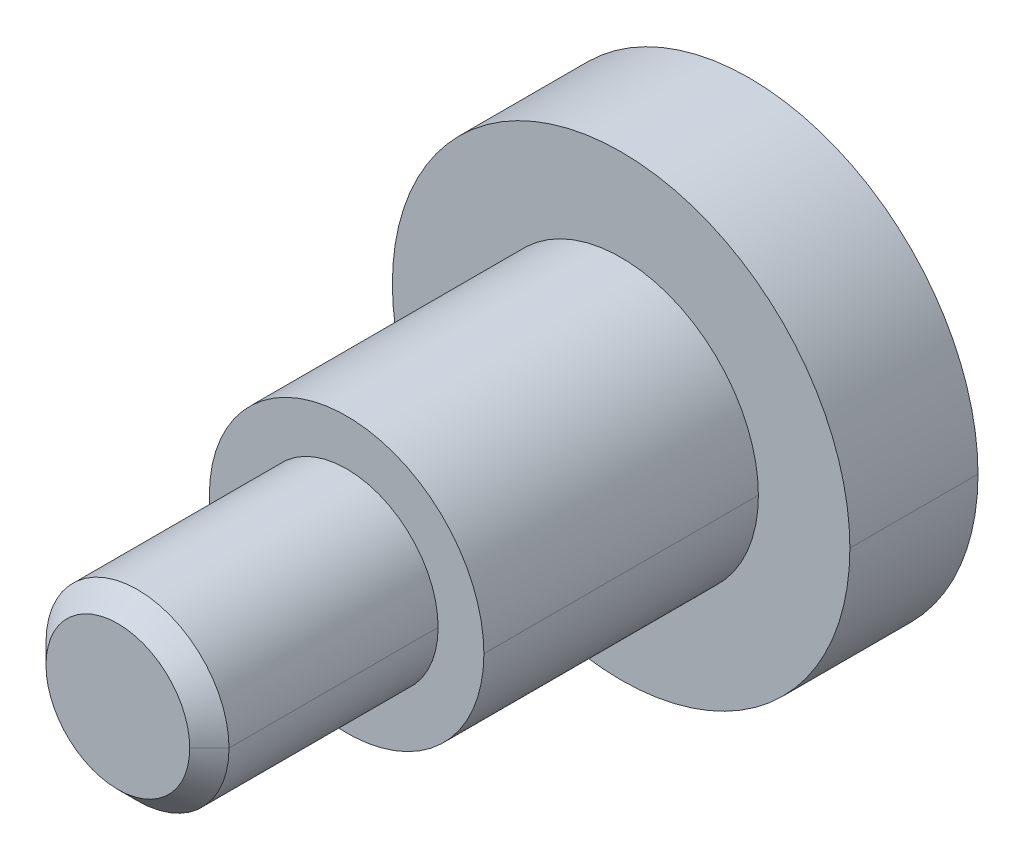
ISO-10303-21;
HEADER;
FILE_DESCRIPTION(('STEP AP214'),'2;1');
FILE_NAME('part.step','',(''),(''),'','','');
FILE_SCHEMA(('AUTOMOTIVE_DESIGN { 1 0 10303 214 1 1 1 1 }'));
ENDSEC;
DATA;
#1=APPLICATION_CONTEXT('core data for automotive mechanical design processes');
#2=APPLICATION_PROTOCOL_DEFINITION('international standard','automotive_design',2000,#1);
#3=PRODUCT_CONTEXT('',#1,'mechanical');
#4=PRODUCT('Part','Part','',(#3));
#5=PRODUCT_RELATED_PRODUCT_CATEGORY('part','',(#4));
#6=PRODUCT_DEFINITION_FORMATION('','',#4);
#7=PRODUCT_DEFINITION_CONTEXT('part definition',#1,'design');
#8=PRODUCT_DEFINITION('design','',#6,#7);
#9=PRODUCT_DEFINITION_SHAPE('','',#8);
#10=(LENGTH_UNIT() NAMED_UNIT(*) SI_UNIT(.MILLI.,.METRE.));
#11=(NAMED_UNIT(*) PLANE_ANGLE_UNIT() SI_UNIT($,.RADIAN.));
#12=(NAMED_UNIT(*) SI_UNIT($,.STERADIAN.) SOLID_ANGLE_UNIT());
#13=UNCERTAINTY_MEASURE_WITH_UNIT(LENGTH_MEASURE(1.E-05),#10,'distance_accuracy_value','');
#14=(GEOMETRIC_REPRESENTATION_CONTEXT(3) GLOBAL_UNCERTAINTY_ASSIGNED_CONTEXT((#13)) GLOBAL_UNIT_ASSIGNED_CONTEXT((#10,
#11,#12)) REPRESENTATION_CONTEXT('',''));
#15=CARTESIAN_POINT('',(0.,0.,0.));
#16=DIRECTION('',(0.,0.,1.));
#17=DIRECTION('',(1.,0.,0.));
#18=AXIS2_PLACEMENT_3D('',#15,#16,#17);
#19=CARTESIAN_POINT('',(0.,0.,2.5));
#20=DIRECTION('',(0.,0.,-1.));
#21=DIRECTION('',(0.,-1.,0.));
#22=AXIS2_PLACEMENT_3D('',#19,#20,#21);
#23=PLANE('',#22);
#24=DIRECTION('',(0.5,0.866025403784439,0.));
#25=VECTOR('',#24,1.);
#26=CARTESIAN_POINT('',(-1.44337567297406,0.,2.5));
#27=LINE('',#26,#25);
#28=CARTESIAN_POINT('',(-1.44337567297406,0.,2.5));
#29=VERTEX_POINT('',#28);
#30=CARTESIAN_POINT('',(-0.721687836487032,1.25,2.5));
#31=VERTEX_POINT('',#30);
#32=EDGE_CURVE('E266',#29,#31,#27,.T.);
#33=ORIENTED_EDGE('',*,*,#32,.T.);
#34=DIRECTION('',(1.,0.,0.));
#35=VECTOR('',#34,1.);
#36=CARTESIAN_POINT('',(-0.721687836487032,1.25,2.5));
#37=LINE('',#36,#35);
#38=CARTESIAN_POINT('',(0.721687836487032,1.25,2.5));
#39=VERTEX_POINT('',#38);
#40=EDGE_CURVE('E9',#31,#39,#37,.T.);
#41=ORIENTED_EDGE('',*,*,#40,.T.);
#42=DIRECTION('',(0.5,-0.866025403784439,0.));
#43=VECTOR('',#42,1.);
#44=CARTESIAN_POINT('',(0.721687836487032,1.25,2.5));
#45=LINE('',#44,#43);
#46=CARTESIAN_POINT('',(1.44337567297406,0.,2.5));
#47=VERTEX_POINT('',#46);
#48=EDGE_CURVE('E42',#39,#47,#45,.T.);
#49=ORIENTED_EDGE('',*,*,#48,.T.);
#50=DIRECTION('',(-0.5,-0.866025403784439,0.));
#51=VECTOR('',#50,1.);
#52=CARTESIAN_POINT('',(1.44337567297406,0.,2.5));
#53=LINE('',#52,#51);
#54=CARTESIAN_POINT('',(0.721687836487032,-1.25,2.5));
#55=VERTEX_POINT('',#54);
#56=EDGE_CURVE('E279',#47,#55,#53,.T.);
#57=ORIENTED_EDGE('',*,*,#56,.T.);
#58=DIRECTION('',(-1.,0.,0.));
#59=VECTOR('',#58,1.);
#60=CARTESIAN_POINT('',(0.721687836487032,-1.25,2.5));
#61=LINE('',#60,#59);
#62=CARTESIAN_POINT('',(-0.721687836487033,-1.25,2.5));
#63=VERTEX_POINT('',#62);
#64=EDGE_CURVE('E273',#55,#63,#61,.T.);
#65=ORIENTED_EDGE('',*,*,#64,.T.);
#66=DIRECTION('',(-0.5,0.866025403784439,0.));
#67=VECTOR('',#66,1.);
#68=CARTESIAN_POINT('',(-0.721687836487033,-1.25,2.5));
#69=LINE('',#68,#67);
#70=EDGE_CURVE('E172',#63,#29,#69,.T.);
#71=ORIENTED_EDGE('',*,*,#70,.T.);
#72=EDGE_LOOP('',(#33,#41,#49,#57,#65,#71));
#73=FACE_BOUND('',#72,.T.);
#74=ADVANCED_FACE('F15',(#73),#23,.T.);
#75=CARTESIAN_POINT('',(-0.721687836487032,1.25,2.5));
#76=DIRECTION('',(0.,1.,0.));
#77=DIRECTION('',(1.,0.,0.));
#78=AXIS2_PLACEMENT_3D('',#75,#76,#77);
#79=PLANE('',#78);
#80=DIRECTION('',(1.,0.,0.));
#81=VECTOR('',#80,1.);
#82=CARTESIAN_POINT('',(-0.721687836487032,1.25,0.));
#83=LINE('',#82,#81);
#84=CARTESIAN_POINT('',(-0.721687836487032,1.25,0.));
#85=VERTEX_POINT('',#84);
#86=CARTESIAN_POINT('',(0.721687836487032,1.25,0.));
#87=VERTEX_POINT('',#86);
#88=EDGE_CURVE('E230',#85,#87,#83,.T.);
#89=ORIENTED_EDGE('',*,*,#88,.T.);
#90=DIRECTION('',(0.,0.,-1.));
#91=VECTOR('',#90,1.);
#92=CARTESIAN_POINT('',(0.721687836487032,1.25,2.5));
#93=LINE('',#92,#91);
#94=EDGE_CURVE('E23',#39,#87,#93,.T.);
#95=ORIENTED_EDGE('',*,*,#94,.F.);
#96=ORIENTED_EDGE('',*,*,#40,.F.);
#97=DIRECTION('',(0.,0.,-1.));
#98=VECTOR('',#97,1.);
#99=CARTESIAN_POINT('',(-0.721687836487032,1.25,2.5));
#100=LINE('',#99,#98);
#101=EDGE_CURVE('E150',#31,#85,#100,.T.);
#102=ORIENTED_EDGE('',*,*,#101,.T.);
#103=EDGE_LOOP('',(#89,#95,#96,#102));
#104=FACE_BOUND('',#103,.T.);
#105=ADVANCED_FACE('F664',(#104),#79,.F.);
#106=CARTESIAN_POINT('',(0.721687836487032,1.25,2.5));
#107=DIRECTION('',(0.866025403784439,0.5,0.));
#108=DIRECTION('',(0.,0.,-1.));
#109=AXIS2_PLACEMENT_3D('',#106,#107,#108);
#110=PLANE('',#109);
#111=DIRECTION('',(0.5,-0.866025403784439,0.));
#112=VECTOR('',#111,1.);
#113=CARTESIAN_POINT('',(0.721687836487032,1.25,0.));
#114=LINE('',#113,#112);
#115=CARTESIAN_POINT('',(1.44337567297406,0.,0.));
#116=VERTEX_POINT('',#115);
#117=EDGE_CURVE('E247',#87,#116,#114,.T.);
#118=ORIENTED_EDGE('',*,*,#117,.T.);
#119=DIRECTION('',(0.,0.,-1.));
#120=VECTOR('',#119,1.);
#121=CARTESIAN_POINT('',(1.44337567297406,0.,2.5));
#122=LINE('',#121,#120);
#123=EDGE_CURVE('E282',#47,#116,#122,.T.);
#124=ORIENTED_EDGE('',*,*,#123,.F.);
#125=ORIENTED_EDGE('',*,*,#48,.F.);
#126=ORIENTED_EDGE('',*,*,#94,.T.);
#127=EDGE_LOOP('',(#118,#124,#125,#126));
#128=FACE_BOUND('',#127,.T.);
#129=ADVANCED_FACE('F495',(#128),#110,.F.);
#130=CARTESIAN_POINT('',(1.44337567297406,0.,2.5));
#131=DIRECTION('',(0.866025403784439,-0.5,0.));
#132=DIRECTION('',(0.,0.,-1.));
#133=AXIS2_PLACEMENT_3D('',#130,#131,#132);
#134=PLANE('',#133);
#135=DIRECTION('',(-0.5,-0.866025403784439,0.));
#136=VECTOR('',#135,1.);
#137=CARTESIAN_POINT('',(1.44337567297406,0.,0.));
#138=LINE('',#137,#136);
#139=CARTESIAN_POINT('',(0.721687836487032,-1.25,0.));
#140=VERTEX_POINT('',#139);
#141=EDGE_CURVE('E243',#116,#140,#138,.T.);
#142=ORIENTED_EDGE('',*,*,#141,.T.);
#143=DIRECTION('',(0.,0.,-1.));
#144=VECTOR('',#143,1.);
#145=CARTESIAN_POINT('',(0.721687836487032,-1.25,2.5));
#146=LINE('',#145,#144);
#147=EDGE_CURVE('E276',#55,#140,#146,.T.);
#148=ORIENTED_EDGE('',*,*,#147,.F.);
#149=ORIENTED_EDGE('',*,*,#56,.F.);
#150=ORIENTED_EDGE('',*,*,#123,.T.);
#151=EDGE_LOOP('',(#142,#148,#149,#150));
#152=FACE_BOUND('',#151,.T.);
#153=ADVANCED_FACE('F489',(#152),#134,.F.);
#154=CARTESIAN_POINT('',(0.721687836487032,-1.25,2.5));
#155=DIRECTION('',(0.,-1.,0.));
#156=DIRECTION('',(0.,0.,-1.));
#157=AXIS2_PLACEMENT_3D('',#154,#155,#156);
#158=PLANE('',#157);
#159=DIRECTION('',(-1.,0.,0.));
#160=VECTOR('',#159,1.);
#161=CARTESIAN_POINT('',(0.721687836487032,-1.25,0.));
#162=LINE('',#161,#160);
#163=CARTESIAN_POINT('',(-0.721687836487033,-1.25,0.));
#164=VERTEX_POINT('',#163);
#165=EDGE_CURVE('E242',#140,#164,#162,.T.);
#166=ORIENTED_EDGE('',*,*,#165,.T.);
#167=DIRECTION('',(0.,0.,-1.));
#168=VECTOR('',#167,1.);
#169=CARTESIAN_POINT('',(-0.721687836487033,-1.25,2.5));
#170=LINE('',#169,#168);
#171=EDGE_CURVE('E174',#63,#164,#170,.T.);
#172=ORIENTED_EDGE('',*,*,#171,.F.);
#173=ORIENTED_EDGE('',*,*,#64,.F.);
#174=ORIENTED_EDGE('',*,*,#147,.T.);
#175=EDGE_LOOP('',(#166,#172,#173,#174));
#176=FACE_BOUND('',#175,.T.);
#177=ADVANCED_FACE('F494',(#176),#158,.F.);
#178=CARTESIAN_POINT('',(-0.721687836487033,-1.25,2.5));
#179=DIRECTION('',(-0.866025403784439,-0.5,0.));
#180=DIRECTION('',(-0.5,0.866025403784439,0.));
#181=AXIS2_PLACEMENT_3D('',#178,#179,#180);
#182=PLANE('',#181);
#183=DIRECTION('',(-0.5,0.866025403784439,0.));
#184=VECTOR('',#183,1.);
#185=CARTESIAN_POINT('',(-0.721687836487033,-1.25,0.));
#186=LINE('',#185,#184);
#187=CARTESIAN_POINT('',(-1.44337567297406,0.,0.));
#188=VERTEX_POINT('',#187);
#189=EDGE_CURVE('E238',#164,#188,#186,.T.);
#190=ORIENTED_EDGE('',*,*,#189,.T.);
#191=DIRECTION('',(0.,0.,-1.));
#192=VECTOR('',#191,1.);
#193=CARTESIAN_POINT('',(-1.44337567297406,0.,2.5));
#194=LINE('',#193,#192);
#195=EDGE_CURVE('E175',#29,#188,#194,.T.);
#196=ORIENTED_EDGE('',*,*,#195,.F.);
#197=ORIENTED_EDGE('',*,*,#70,.F.);
#198=ORIENTED_EDGE('',*,*,#171,.T.);
#199=EDGE_LOOP('',(#190,#196,#197,#198));
#200=FACE_BOUND('',#199,.T.);
#201=ADVANCED_FACE('F591',(#200),#182,.F.);
#202=CARTESIAN_POINT('',(-1.44337567297406,0.,2.5));
#203=DIRECTION('',(-0.866025403784439,0.5,0.));
#204=DIRECTION('',(0.,0.,1.));
#205=AXIS2_PLACEMENT_3D('',#202,#203,#204);
#206=PLANE('',#205);
#207=DIRECTION('',(0.5,0.866025403784439,0.));
#208=VECTOR('',#207,1.);
#209=CARTESIAN_POINT('',(-1.44337567297406,0.,0.));
#210=LINE('',#209,#208);
#211=EDGE_CURVE('E234',#188,#85,#210,.T.);
#212=ORIENTED_EDGE('',*,*,#211,.T.);
#213=ORIENTED_EDGE('',*,*,#101,.F.);
#214=ORIENTED_EDGE('',*,*,#32,.F.);
#215=ORIENTED_EDGE('',*,*,#195,.T.);
#216=EDGE_LOOP('',(#212,#213,#214,#215));
#217=FACE_BOUND('',#216,.T.);
#218=ADVANCED_FACE('F595',(#217),#206,.F.);
#219=CARTESIAN_POINT('',(0.,0.,13.8));
#220=DIRECTION('',(0.,0.,-1.));
#221=DIRECTION('',(-1.,0.,0.));
#222=AXIS2_PLACEMENT_3D('',#219,#220,#221);
#223=CONICAL_SURFACE('',#222,1.5705,0.785398163397446);
#224=DIRECTION('',(0.707106781186546,0.,-0.707106781186549));
#225=VECTOR('',#224,1.);
#226=CARTESIAN_POINT('',(1.5705,0.,13.8));
#227=LINE('',#226,#225);
#228=CARTESIAN_POINT('',(1.5705,0.,13.8));
#229=VERTEX_POINT('',#228);
#230=CARTESIAN_POINT('',(2.,0.,13.3705));
#231=VERTEX_POINT('',#230);
#232=EDGE_CURVE('E154',#229,#231,#227,.T.);
#233=ORIENTED_EDGE('',*,*,#232,.F.);
#234=CARTESIAN_POINT('',(0.,0.,13.8));
#235=DIRECTION('',(0.,0.,1.));
#236=DIRECTION('',(1.,0.,0.));
#237=AXIS2_PLACEMENT_3D('',#234,#235,#236);
#238=CIRCLE('',#237,1.5705);
#239=CARTESIAN_POINT('',(-1.5705,0.,13.8));
#240=VERTEX_POINT('',#239);
#241=EDGE_CURVE('E141',#240,#229,#238,.T.);
#242=ORIENTED_EDGE('',*,*,#241,.F.);
#243=DIRECTION('',(-0.707106781186546,0.,-0.707106781186549));
#244=VECTOR('',#243,1.);
#245=CARTESIAN_POINT('',(-1.5705,0.,13.8));
#246=LINE('',#245,#244);
#247=CARTESIAN_POINT('',(-2.,0.,13.3705));
#248=VERTEX_POINT('',#247);
#249=EDGE_CURVE('E163',#240,#248,#246,.T.);
#250=ORIENTED_EDGE('',*,*,#249,.T.);
#251=CARTESIAN_POINT('',(0.,0.,13.3705));
#252=DIRECTION('',(0.,0.,-1.));
#253=DIRECTION('',(1.,0.,0.));
#254=AXIS2_PLACEMENT_3D('',#251,#252,#253);
#255=CIRCLE('',#254,2.);
#256=EDGE_CURVE('E151',#231,#248,#255,.T.);
#257=ORIENTED_EDGE('',*,*,#256,.F.);
#258=EDGE_LOOP('',(#233,#242,#250,#257));
#259=FACE_BOUND('',#258,.T.);
#260=ADVANCED_FACE('F155',(#259),#223,.T.);
#261=CARTESIAN_POINT('',(0.,0.,13.8));
#262=DIRECTION('',(0.,0.,1.));
#263=DIRECTION('',(1.,0.,0.));
#264=AXIS2_PLACEMENT_3D('',#261,#262,#263);
#265=PLANE('',#264);
#266=ORIENTED_EDGE('',*,*,#241,.T.);
#267=CARTESIAN_POINT('',(0.,0.,13.8));
#268=DIRECTION('',(0.,0.,1.));
#269=DIRECTION('',(1.,0.,0.));
#270=AXIS2_PLACEMENT_3D('',#267,#268,#269);
#271=CIRCLE('',#270,1.5705);
#272=EDGE_CURVE('E145',#229,#240,#271,.T.);
#273=ORIENTED_EDGE('',*,*,#272,.T.);
#274=EDGE_LOOP('',(#266,#273));
#275=FACE_BOUND('',#274,.T.);
#276=ADVANCED_FACE('F143',(#275),#265,.T.);
#277=CARTESIAN_POINT('',(0.,0.,13.8));
#278=DIRECTION('',(0.,0.,-1.));
#279=DIRECTION('',(-1.,0.,0.));
#280=AXIS2_PLACEMENT_3D('',#277,#278,#279);
#281=CYLINDRICAL_SURFACE('',#280,2.);
#282=DIRECTION('',(0.,0.,-1.));
#283=VECTOR('',#282,1.);
#284=CARTESIAN_POINT('',(2.,0.,13.8));
#285=LINE('',#284,#283);
#286=CARTESIAN_POINT('',(2.,0.,8.8));
#287=VERTEX_POINT('',#286);
#288=EDGE_CURVE('E183',#231,#287,#285,.T.);
#289=ORIENTED_EDGE('',*,*,#288,.F.);
#290=ORIENTED_EDGE('',*,*,#256,.T.);
#291=DIRECTION('',(0.,0.,-1.));
#292=VECTOR('',#291,1.);
#293=CARTESIAN_POINT('',(-2.,0.,13.8));
#294=LINE('',#293,#292);
#295=CARTESIAN_POINT('',(-2.,0.,8.8));
#296=VERTEX_POINT('',#295);
#297=EDGE_CURVE('E191',#248,#296,#294,.T.);
#298=ORIENTED_EDGE('',*,*,#297,.T.);
#299=CARTESIAN_POINT('',(0.,0.,8.8));
#300=DIRECTION('',(0.,0.,1.));
#301=DIRECTION('',(1.,0.,0.));
#302=AXIS2_PLACEMENT_3D('',#299,#300,#301);
#303=CIRCLE('',#302,2.);
#304=EDGE_CURVE('E259',#296,#287,#303,.T.);
#305=ORIENTED_EDGE('',*,*,#304,.T.);
#306=EDGE_LOOP('',(#289,#290,#298,#305));
#307=FACE_BOUND('',#306,.T.);
#308=ADVANCED_FACE('F503',(#307),#281,.T.);
#309=CARTESIAN_POINT('',(0.,0.,8.8));
#310=DIRECTION('',(0.,0.,1.));
#311=DIRECTION('',(1.,0.,0.));
#312=AXIS2_PLACEMENT_3D('',#309,#310,#311);
#313=PLANE('',#312);
#314=ORIENTED_EDGE('',*,*,#304,.F.);
#315=CARTESIAN_POINT('',(0.,0.,8.8));
#316=DIRECTION('',(0.,0.,1.));
#317=DIRECTION('',(1.,0.,0.));
#318=AXIS2_PLACEMENT_3D('',#315,#316,#317);
#319=CIRCLE('',#318,2.);
#320=EDGE_CURVE('E187',#287,#296,#319,.T.);
#321=ORIENTED_EDGE('',*,*,#320,.F.);
#322=EDGE_LOOP('',(#314,#321));
#323=FACE_BOUND('',#322,.T.);
#324=CARTESIAN_POINT('',(0.,0.,8.8));
#325=DIRECTION('',(0.,0.,1.));
#326=DIRECTION('',(1.,0.,0.));
#327=AXIS2_PLACEMENT_3D('',#324,#325,#326);
#328=CIRCLE('',#327,3.);
#329=CARTESIAN_POINT('',(-3.,0.,8.8));
#330=VERTEX_POINT('',#329);
#331=CARTESIAN_POINT('',(3.,0.,8.8));
#332=VERTEX_POINT('',#331);
#333=EDGE_CURVE('E254',#330,#332,#328,.T.);
#334=ORIENTED_EDGE('',*,*,#333,.T.);
#335=CARTESIAN_POINT('',(0.,0.,8.8));
#336=DIRECTION('',(0.,0.,1.));
#337=DIRECTION('',(1.,0.,0.));
#338=AXIS2_PLACEMENT_3D('',#335,#336,#337);
#339=CIRCLE('',#338,3.);
#340=EDGE_CURVE('E195',#332,#330,#339,.T.);
#341=ORIENTED_EDGE('',*,*,#340,.T.);
#342=EDGE_LOOP('',(#334,#341));
#343=FACE_BOUND('',#342,.T.);
#344=ADVANCED_FACE('F507',(#323,#343),#313,.T.);
#345=CARTESIAN_POINT('',(0.,0.,8.8));
#346=DIRECTION('',(0.,0.,-1.));
#347=DIRECTION('',(-1.,0.,0.));
#348=AXIS2_PLACEMENT_3D('',#345,#346,#347);
#349=CYLINDRICAL_SURFACE('',#348,3.);
#350=DIRECTION('',(0.,0.,-1.));
#351=VECTOR('',#350,1.);
#352=CARTESIAN_POINT('',(3.,0.,8.8));
#353=LINE('',#352,#351);
#354=CARTESIAN_POINT('',(3.,0.,2.8));
#355=VERTEX_POINT('',#354);
#356=EDGE_CURVE('E204',#332,#355,#353,.T.);
#357=ORIENTED_EDGE('',*,*,#356,.F.);
#358=ORIENTED_EDGE('',*,*,#333,.F.);
#359=DIRECTION('',(0.,0.,-1.));
#360=VECTOR('',#359,1.);
#361=CARTESIAN_POINT('',(-3.,0.,8.8));
#362=LINE('',#361,#360);
#363=CARTESIAN_POINT('',(-3.,0.,2.8));
#364=VERTEX_POINT('',#363);
#365=EDGE_CURVE('E182',#330,#364,#362,.T.);
#366=ORIENTED_EDGE('',*,*,#365,.T.);
#367=CARTESIAN_POINT('',(0.,0.,2.8));
#368=DIRECTION('',(0.,0.,1.));
#369=DIRECTION('',(1.,0.,0.));
#370=AXIS2_PLACEMENT_3D('',#367,#368,#369);
#371=CIRCLE('',#370,3.);
#372=EDGE_CURVE('E227',#364,#355,#371,.T.);
#373=ORIENTED_EDGE('',*,*,#372,.T.);
#374=EDGE_LOOP('',(#357,#358,#366,#373));
#375=FACE_BOUND('',#374,.T.);
#376=ADVANCED_FACE('F583',(#375),#349,.T.);
#377=CARTESIAN_POINT('',(0.,0.,0.));
#378=DIRECTION('',(0.,0.,1.));
#379=DIRECTION('',(1.,0.,0.));
#380=AXIS2_PLACEMENT_3D('',#377,#378,#379);
#381=PLANE('',#380);
#382=ORIENTED_EDGE('',*,*,#88,.F.);
#383=ORIENTED_EDGE('',*,*,#211,.F.);
#384=ORIENTED_EDGE('',*,*,#189,.F.);
#385=ORIENTED_EDGE('',*,*,#165,.F.);
#386=ORIENTED_EDGE('',*,*,#141,.F.);
#387=ORIENTED_EDGE('',*,*,#117,.F.);
#388=EDGE_LOOP('',(#382,#383,#384,#385,#386,#387));
#389=FACE_BOUND('',#388,.T.);
#390=CARTESIAN_POINT('',(0.,0.,0.));
#391=DIRECTION('',(0.,0.,1.));
#392=DIRECTION('',(1.,0.,0.));
#393=AXIS2_PLACEMENT_3D('',#390,#391,#392);
#394=CIRCLE('',#393,5.);
#395=CARTESIAN_POINT('',(-5.,0.,0.));
#396=VERTEX_POINT('',#395);
#397=CARTESIAN_POINT('',(5.,0.,0.));
#398=VERTEX_POINT('',#397);
#399=EDGE_CURVE('E199',#396,#398,#394,.T.);
#400=ORIENTED_EDGE('',*,*,#399,.F.);
#401=CARTESIAN_POINT('',(0.,0.,0.));
#402=DIRECTION('',(0.,0.,1.));
#403=DIRECTION('',(1.,0.,0.));
#404=AXIS2_PLACEMENT_3D('',#401,#402,#403);
#405=CIRCLE('',#404,5.);
#406=EDGE_CURVE('E205',#398,#396,#405,.T.);
#407=ORIENTED_EDGE('',*,*,#406,.F.);
#408=EDGE_LOOP('',(#400,#407));
#409=FACE_BOUND('',#408,.T.);
#410=ADVANCED_FACE('F530',(#389,#409),#381,.F.);
#411=CARTESIAN_POINT('',(0.,0.,2.8));
#412=DIRECTION('',(0.,0.,1.));
#413=DIRECTION('',(1.,0.,0.));
#414=AXIS2_PLACEMENT_3D('',#411,#412,#413);
#415=PLANE('',#414);
#416=ORIENTED_EDGE('',*,*,#372,.F.);
#417=CARTESIAN_POINT('',(0.,0.,2.8));
#418=DIRECTION('',(0.,0.,1.));
#419=DIRECTION('',(1.,0.,0.));
#420=AXIS2_PLACEMENT_3D('',#417,#418,#419);
#421=CIRCLE('',#420,3.);
#422=EDGE_CURVE('E212',#355,#364,#421,.T.);
#423=ORIENTED_EDGE('',*,*,#422,.F.);
#424=EDGE_LOOP('',(#416,#423));
#425=FACE_BOUND('',#424,.T.);
#426=CARTESIAN_POINT('',(0.,0.,2.8));
#427=DIRECTION('',(0.,0.,1.));
#428=DIRECTION('',(1.,0.,0.));
#429=AXIS2_PLACEMENT_3D('',#426,#427,#428);
#430=CIRCLE('',#429,5.);
#431=CARTESIAN_POINT('',(-5.,0.,2.8));
#432=VERTEX_POINT('',#431);
#433=CARTESIAN_POINT('',(5.,0.,2.8));
#434=VERTEX_POINT('',#433);
#435=EDGE_CURVE('E196',#432,#434,#430,.T.);
#436=ORIENTED_EDGE('',*,*,#435,.T.);
#437=CARTESIAN_POINT('',(0.,0.,2.8));
#438=DIRECTION('',(0.,0.,1.));
#439=DIRECTION('',(1.,0.,0.));
#440=AXIS2_PLACEMENT_3D('',#437,#438,#439);
#441=CIRCLE('',#440,5.);
#442=EDGE_CURVE('E177',#434,#432,#441,.T.);
#443=ORIENTED_EDGE('',*,*,#442,.T.);
#444=EDGE_LOOP('',(#436,#443));
#445=FACE_BOUND('',#444,.T.);
#446=ADVANCED_FACE('F525',(#425,#445),#415,.T.);
#447=CARTESIAN_POINT('',(0.,0.,2.8));
#448=DIRECTION('',(0.,0.,-1.));
#449=DIRECTION('',(-1.,0.,0.));
#450=AXIS2_PLACEMENT_3D('',#447,#448,#449);
#451=CYLINDRICAL_SURFACE('',#450,5.);
#452=DIRECTION('',(0.,0.,-1.));
#453=VECTOR('',#452,1.);
#454=CARTESIAN_POINT('',(5.,0.,2.8));
#455=LINE('',#454,#453);
#456=EDGE_CURVE('E181',#434,#398,#455,.T.);
#457=ORIENTED_EDGE('',*,*,#456,.F.);
#458=ORIENTED_EDGE('',*,*,#435,.F.);
#459=DIRECTION('',(0.,0.,-1.));
#460=VECTOR('',#459,1.);
#461=CARTESIAN_POINT('',(-5.,0.,2.8));
#462=LINE('',#461,#460);
#463=EDGE_CURVE('E200',#432,#396,#462,.T.);
#464=ORIENTED_EDGE('',*,*,#463,.T.);
#465=ORIENTED_EDGE('',*,*,#399,.T.);
#466=EDGE_LOOP('',(#457,#458,#464,#465));
#467=FACE_BOUND('',#466,.T.);
#468=ADVANCED_FACE('F529',(#467),#451,.T.);
#469=CARTESIAN_POINT('',(0.,0.,2.8));
#470=DIRECTION('',(0.,0.,-1.));
#471=DIRECTION('',(-1.,0.,0.));
#472=AXIS2_PLACEMENT_3D('',#469,#470,#471);
#473=CYLINDRICAL_SURFACE('',#472,5.);
#474=ORIENTED_EDGE('',*,*,#442,.F.);
#475=ORIENTED_EDGE('',*,*,#456,.T.);
#476=ORIENTED_EDGE('',*,*,#406,.T.);
#477=ORIENTED_EDGE('',*,*,#463,.F.);
#478=EDGE_LOOP('',(#474,#475,#476,#477));
#479=FACE_BOUND('',#478,.T.);
#480=ADVANCED_FACE('F552',(#479),#473,.T.);
#481=CARTESIAN_POINT('',(0.,0.,8.8));
#482=DIRECTION('',(0.,0.,-1.));
#483=DIRECTION('',(-1.,0.,0.));
#484=AXIS2_PLACEMENT_3D('',#481,#482,#483);
#485=CYLINDRICAL_SURFACE('',#484,3.);
#486=ORIENTED_EDGE('',*,*,#340,.F.);
#487=ORIENTED_EDGE('',*,*,#356,.T.);
#488=ORIENTED_EDGE('',*,*,#422,.T.);
#489=ORIENTED_EDGE('',*,*,#365,.F.);
#490=EDGE_LOOP('',(#486,#487,#488,#489));
#491=FACE_BOUND('',#490,.T.);
#492=ADVANCED_FACE('F541',(#491),#485,.T.);
#493=CARTESIAN_POINT('',(0.,0.,13.8));
#494=DIRECTION('',(0.,0.,-1.));
#495=DIRECTION('',(-1.,0.,0.));
#496=AXIS2_PLACEMENT_3D('',#493,#494,#495);
#497=CYLINDRICAL_SURFACE('',#496,2.);
#498=CARTESIAN_POINT('',(0.,0.,13.3705));
#499=DIRECTION('',(0.,0.,-1.));
#500=DIRECTION('',(1.,0.,0.));
#501=AXIS2_PLACEMENT_3D('',#498,#499,#500);
#502=CIRCLE('',#501,2.);
#503=EDGE_CURVE('E160',#248,#231,#502,.T.);
#504=ORIENTED_EDGE('',*,*,#503,.T.);
#505=ORIENTED_EDGE('',*,*,#288,.T.);
#506=ORIENTED_EDGE('',*,*,#320,.T.);
#507=ORIENTED_EDGE('',*,*,#297,.F.);
#508=EDGE_LOOP('',(#504,#505,#506,#507));
#509=FACE_BOUND('',#508,.T.);
#510=ADVANCED_FACE('F518',(#509),#497,.T.);
#511=CARTESIAN_POINT('',(0.,0.,13.8));
#512=DIRECTION('',(0.,0.,-1.));
#513=DIRECTION('',(-1.,0.,0.));
#514=AXIS2_PLACEMENT_3D('',#511,#512,#513);
#515=CONICAL_SURFACE('',#514,1.5705,0.785398163397446);
#516=ORIENTED_EDGE('',*,*,#272,.F.);
#517=ORIENTED_EDGE('',*,*,#232,.T.);
#518=ORIENTED_EDGE('',*,*,#503,.F.);
#519=ORIENTED_EDGE('',*,*,#249,.F.);
#520=EDGE_LOOP('',(#516,#517,#518,#519));
#521=FACE_BOUND('',#520,.T.);
#522=ADVANCED_FACE('F162',(#521),#515,.T.);
#523=CLOSED_SHELL('',(#74,#105,#129,#153,#177,#201,#218,#260,#276,#308,#344,#376,#410,#446,#468,
#480,#492,#510,#522));
#524=MANIFOLD_SOLID_BREP('B1',#523);
#525=ADVANCED_BREP_SHAPE_REPRESENTATION('',(#18,#524),#14);
#526=SHAPE_DEFINITION_REPRESENTATION(#9,#525);
ENDSEC;
END-ISO-10303-21;
